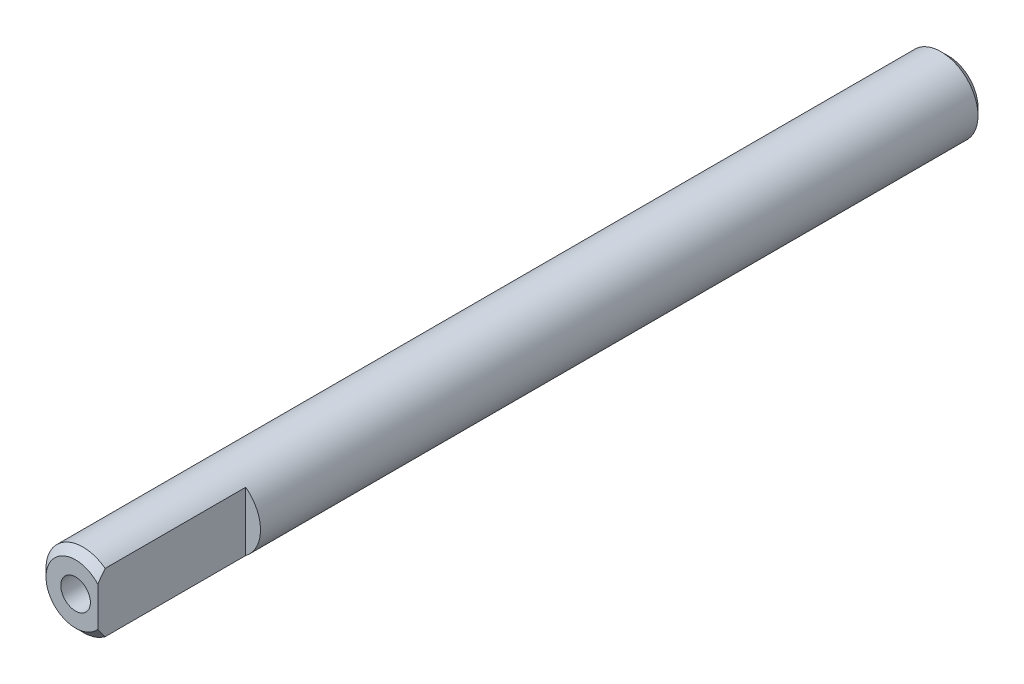
ISO-10303-21;
HEADER;
FILE_DESCRIPTION(('STEP AP214'),'2;1');
FILE_NAME('part.step','',(''),(''),'','','');
FILE_SCHEMA(('AUTOMOTIVE_DESIGN { 1 0 10303 214 1 1 1 1 }'));
ENDSEC;
DATA;
#1=APPLICATION_CONTEXT('core data for automotive mechanical design processes');
#2=APPLICATION_PROTOCOL_DEFINITION('international standard','automotive_design',2000,#1);
#3=PRODUCT_CONTEXT('',#1,'mechanical');
#4=PRODUCT('Part','Part','',(#3));
#5=PRODUCT_RELATED_PRODUCT_CATEGORY('part','',(#4));
#6=PRODUCT_DEFINITION_FORMATION('','',#4);
#7=PRODUCT_DEFINITION_CONTEXT('part definition',#1,'design');
#8=PRODUCT_DEFINITION('design','',#6,#7);
#9=PRODUCT_DEFINITION_SHAPE('','',#8);
#10=(LENGTH_UNIT() NAMED_UNIT(*) SI_UNIT(.MILLI.,.METRE.));
#11=(NAMED_UNIT(*) PLANE_ANGLE_UNIT() SI_UNIT($,.RADIAN.));
#12=(NAMED_UNIT(*) SI_UNIT($,.STERADIAN.) SOLID_ANGLE_UNIT());
#13=UNCERTAINTY_MEASURE_WITH_UNIT(LENGTH_MEASURE(1.E-05),#10,'distance_accuracy_value','');
#14=(GEOMETRIC_REPRESENTATION_CONTEXT(3) GLOBAL_UNCERTAINTY_ASSIGNED_CONTEXT((#13)) GLOBAL_UNIT_ASSIGNED_CONTEXT((#10,
#11,#12)) REPRESENTATION_CONTEXT('',''));
#15=CARTESIAN_POINT('',(0.,0.,0.));
#16=DIRECTION('',(0.,0.,1.));
#17=DIRECTION('',(1.,0.,0.));
#18=AXIS2_PLACEMENT_3D('',#15,#16,#17);
#19=CARTESIAN_POINT('',(0.,0.,59.));
#20=DIRECTION('',(0.,0.,-1.));
#21=DIRECTION('',(-1.,0.,0.));
#22=AXIS2_PLACEMENT_3D('',#19,#20,#21);
#23=CYLINDRICAL_SURFACE('',#22,2.5);
#24=CARTESIAN_POINT('',(0.,0.,58.5));
#25=DIRECTION('',(0.,0.,1.));
#26=DIRECTION('',(1.,0.,0.));
#27=AXIS2_PLACEMENT_3D('',#24,#25,#26);
#28=CIRCLE('',#27,2.5);
#29=CARTESIAN_POINT('',(1.5,-2.,58.5));
#30=VERTEX_POINT('',#29);
#31=CARTESIAN_POINT('',(1.5,2.,58.5));
#32=VERTEX_POINT('',#31);
#33=EDGE_CURVE('E121',#30,#32,#28,.F.);
#34=ORIENTED_EDGE('',*,*,#33,.T.);
#35=DIRECTION('',(0.,0.,-1.));
#36=VECTOR('',#35,1.);
#37=CARTESIAN_POINT('',(1.5,2.,59.));
#38=LINE('',#37,#36);
#39=CARTESIAN_POINT('',(1.5,2.,49.));
#40=VERTEX_POINT('',#39);
#41=EDGE_CURVE('E54',#32,#40,#38,.T.);
#42=ORIENTED_EDGE('',*,*,#41,.T.);
#43=CARTESIAN_POINT('',(0.,0.,49.));
#44=DIRECTION('',(0.,0.,-1.));
#45=DIRECTION('',(-1.,0.,0.));
#46=AXIS2_PLACEMENT_3D('',#43,#44,#45);
#47=CIRCLE('',#46,2.5);
#48=CARTESIAN_POINT('',(1.5,-2.,49.));
#49=VERTEX_POINT('',#48);
#50=EDGE_CURVE('E11',#40,#49,#47,.T.);
#51=ORIENTED_EDGE('',*,*,#50,.T.);
#52=DIRECTION('',(0.,0.,-1.));
#53=VECTOR('',#52,1.);
#54=CARTESIAN_POINT('',(1.5,-2.,59.));
#55=LINE('',#54,#53);
#56=EDGE_CURVE('E131',#49,#30,#55,.F.);
#57=ORIENTED_EDGE('',*,*,#56,.T.);
#58=EDGE_LOOP('',(#34,#42,#51,#57));
#59=FACE_BOUND('',#58,.T.);
#60=CARTESIAN_POINT('',(0.,0.,0.499999999999987));
#61=DIRECTION('',(0.,0.,1.));
#62=DIRECTION('',(1.,0.,0.));
#63=AXIS2_PLACEMENT_3D('',#60,#61,#62);
#64=CIRCLE('',#63,2.5);
#65=CARTESIAN_POINT('',(2.5,0.,0.499999999999987));
#66=VERTEX_POINT('',#65);
#67=EDGE_CURVE('E81',#66,#66,#64,.T.);
#68=ORIENTED_EDGE('',*,*,#67,.T.);
#69=EDGE_LOOP('',(#68));
#70=FACE_BOUND('',#69,.T.);
#71=ADVANCED_FACE('F32',(#59,#70),#23,.T.);
#72=CARTESIAN_POINT('',(0.,0.,59.));
#73=DIRECTION('',(0.,0.,1.));
#74=DIRECTION('',(1.,0.,0.));
#75=AXIS2_PLACEMENT_3D('',#72,#73,#74);
#76=PLANE('',#75);
#77=DIRECTION('',(0.,-1.,0.));
#78=VECTOR('',#77,1.);
#79=CARTESIAN_POINT('',(1.5,2.0137577840586,59.));
#80=LINE('',#79,#78);
#81=CARTESIAN_POINT('',(1.5,1.32287565553229,59.));
#82=VERTEX_POINT('',#81);
#83=CARTESIAN_POINT('',(1.5,-1.32287565553229,59.));
#84=VERTEX_POINT('',#83);
#85=EDGE_CURVE('E48',#82,#84,#80,.T.);
#86=ORIENTED_EDGE('',*,*,#85,.F.);
#87=CARTESIAN_POINT('',(0.,0.,59.));
#88=DIRECTION('',(0.,0.,1.));
#89=DIRECTION('',(1.,0.,0.));
#90=AXIS2_PLACEMENT_3D('',#87,#88,#89);
#91=CIRCLE('',#90,1.99999999999999);
#92=EDGE_CURVE('E75',#82,#84,#91,.T.);
#93=ORIENTED_EDGE('',*,*,#92,.T.);
#94=EDGE_LOOP('',(#86,#93));
#95=FACE_BOUND('',#94,.T.);
#96=CARTESIAN_POINT('',(0.,0.,59.));
#97=DIRECTION('',(0.,0.,1.));
#98=DIRECTION('',(1.,0.,0.));
#99=AXIS2_PLACEMENT_3D('',#96,#97,#98);
#100=CIRCLE('',#99,1.);
#101=CARTESIAN_POINT('',(1.,0.,59.));
#102=VERTEX_POINT('',#101);
#103=EDGE_CURVE('E125',#102,#102,#100,.T.);
#104=ORIENTED_EDGE('',*,*,#103,.F.);
#105=EDGE_LOOP('',(#104));
#106=FACE_BOUND('',#105,.T.);
#107=ADVANCED_FACE('F73',(#95,#106),#76,.T.);
#108=CARTESIAN_POINT('',(0.,0.,0.));
#109=DIRECTION('',(0.,0.,1.));
#110=DIRECTION('',(1.,0.,0.));
#111=AXIS2_PLACEMENT_3D('',#108,#109,#110);
#112=PLANE('',#111);
#113=CARTESIAN_POINT('',(0.,0.,0.));
#114=DIRECTION('',(0.,0.,1.));
#115=DIRECTION('',(1.,0.,0.));
#116=AXIS2_PLACEMENT_3D('',#113,#114,#115);
#117=CIRCLE('',#116,2.00000000000002);
#118=CARTESIAN_POINT('',(2.00000000000002,0.,0.));
#119=VERTEX_POINT('',#118);
#120=EDGE_CURVE('E78',#119,#119,#117,.F.);
#121=ORIENTED_EDGE('',*,*,#120,.T.);
#122=EDGE_LOOP('',(#121));
#123=FACE_BOUND('',#122,.T.);
#124=ADVANCED_FACE('F102',(#123),#112,.F.);
#125=CARTESIAN_POINT('',(0.,0.,49.));
#126=DIRECTION('',(0.,0.,1.));
#127=DIRECTION('',(1.,0.,0.));
#128=AXIS2_PLACEMENT_3D('',#125,#126,#127);
#129=CYLINDRICAL_SURFACE('',#128,1.);
#130=CARTESIAN_POINT('',(0.,0.,49.));
#131=DIRECTION('',(0.,0.,1.));
#132=DIRECTION('',(1.,0.,0.));
#133=AXIS2_PLACEMENT_3D('',#130,#131,#132);
#134=CIRCLE('',#133,1.);
#135=CARTESIAN_POINT('',(1.,0.,49.));
#136=VERTEX_POINT('',#135);
#137=EDGE_CURVE('E122',#136,#136,#134,.T.);
#138=ORIENTED_EDGE('',*,*,#137,.F.);
#139=EDGE_LOOP('',(#138));
#140=FACE_BOUND('',#139,.T.);
#141=ORIENTED_EDGE('',*,*,#103,.T.);
#142=EDGE_LOOP('',(#141));
#143=FACE_BOUND('',#142,.T.);
#144=ADVANCED_FACE('F98',(#140,#143),#129,.F.);
#145=CARTESIAN_POINT('',(0.,0.,49.));
#146=DIRECTION('',(0.,0.,1.));
#147=DIRECTION('',(1.,0.,0.));
#148=AXIS2_PLACEMENT_3D('',#145,#146,#147);
#149=PLANE('',#148);
#150=ORIENTED_EDGE('',*,*,#137,.T.);
#151=EDGE_LOOP('',(#150));
#152=FACE_BOUND('',#151,.T.);
#153=ADVANCED_FACE('F94',(#152),#149,.T.);
#154=CARTESIAN_POINT('',(0.,0.,0.499999999999987));
#155=DIRECTION('',(0.,0.,1.));
#156=DIRECTION('',(1.,0.,0.));
#157=AXIS2_PLACEMENT_3D('',#154,#155,#156);
#158=CONICAL_SURFACE('',#157,2.5,0.785398163397446);
#159=ORIENTED_EDGE('',*,*,#120,.F.);
#160=EDGE_LOOP('',(#159));
#161=FACE_BOUND('',#160,.T.);
#162=ORIENTED_EDGE('',*,*,#67,.F.);
#163=EDGE_LOOP('',(#162));
#164=FACE_BOUND('',#163,.T.);
#165=ADVANCED_FACE('F97',(#161,#164),#158,.T.);
#166=CARTESIAN_POINT('',(0.,0.,59.));
#167=DIRECTION('',(0.,0.,-1.));
#168=DIRECTION('',(-1.,0.,0.));
#169=AXIS2_PLACEMENT_3D('',#166,#167,#168);
#170=CONICAL_SURFACE('',#169,1.99999999999999,0.785398163397446);
#171=CARTESIAN_POINT('',(1.5,4.73877766066217,56.0294855681538));
#172=CARTESIAN_POINT('',(1.5,4.57087688496675,56.1894995243112));
#173=CARTESIAN_POINT('',(1.5,4.4026412725615,56.3491686097775));
#174=CARTESIAN_POINT('',(1.5,4.06504406572239,56.6674191827178));
#175=CARTESIAN_POINT('',(1.5,3.89568212935415,56.8260003071563));
#176=CARTESIAN_POINT('',(1.5,3.55381801072381,57.1431185138608));
#177=CARTESIAN_POINT('',(1.5,3.38130131701554,57.3016399799348));
#178=CARTESIAN_POINT('',(1.5,3.03406968083858,57.6162003868283));
#179=CARTESIAN_POINT('',(1.5,2.85935519817906,57.7722398319471));
#180=CARTESIAN_POINT('',(1.5,2.56436967895075,58.029699684085));
#181=CARTESIAN_POINT('',(1.5,2.44506547574178,58.1322257249929));
#182=CARTESIAN_POINT('',(1.5,2.20415663927864,58.3346678933572));
#183=CARTESIAN_POINT('',(1.5,2.08255105769494,58.4345829026498));
#184=CARTESIAN_POINT('',(1.5,1.89781800131047,58.5812533338808));
#185=CARTESIAN_POINT('',(1.5,1.83592231177611,58.629558352091));
#186=CARTESIAN_POINT('',(1.5,1.71112471879182,58.724847752878));
#187=CARTESIAN_POINT('',(1.5,1.64822287767979,58.7718322167785));
#188=CARTESIAN_POINT('',(1.5,1.52121957181447,58.8640681693664));
#189=CARTESIAN_POINT('',(1.5,1.45711892352518,58.9093207778492));
#190=CARTESIAN_POINT('',(1.5,1.32739258678534,58.9975747339442));
#191=CARTESIAN_POINT('',(1.5,1.26176720929576,59.0405765348783));
#192=CARTESIAN_POINT('',(1.5,1.14377613499673,59.114102161164));
#193=CARTESIAN_POINT('',(1.5,1.09179339806719,59.1452378266735));
#194=CARTESIAN_POINT('',(1.5,0.986495644009836,59.2052025641598));
#195=CARTESIAN_POINT('',(1.5,0.93318043551107,59.234031302286));
#196=CARTESIAN_POINT('',(1.5,0.825060030354659,59.2886982840608));
#197=CARTESIAN_POINT('',(1.5,0.770255829921558,59.3145384692095));
#198=CARTESIAN_POINT('',(1.5,0.659021720111626,59.362385498086));
#199=CARTESIAN_POINT('',(1.5,0.602592311849216,59.384393508982));
#200=CARTESIAN_POINT('',(1.5,0.457667787547021,59.4338815356688));
#201=CARTESIAN_POINT('',(1.5,0.367977824314464,59.4581125580888));
#202=CARTESIAN_POINT('',(1.5,0.231531062374166,59.4828971991606));
#203=CARTESIAN_POINT('',(1.5,0.185796860832829,59.4892309275958));
#204=CARTESIAN_POINT('',(1.5,0.0939332807516576,59.4977558046999));
#205=CARTESIAN_POINT('',(1.5,0.0478039269300878,59.4999472106131));
#206=CARTESIAN_POINT('',(1.5,-0.0446213260047386,59.5000511071121));
#207=CARTESIAN_POINT('',(1.5,-0.0909172370300651,59.4979484340554));
#208=CARTESIAN_POINT('',(1.5,-0.183125422109013,59.4895610051492));
#209=CARTESIAN_POINT('',(1.5,-0.229037670342021,59.4832759700843));
#210=CARTESIAN_POINT('',(1.5,-0.320308085056699,59.4668419462001));
#211=CARTESIAN_POINT('',(1.5,-0.365663991153476,59.4566805796926));
#212=CARTESIAN_POINT('',(1.5,-0.455470901434249,59.4329717690875));
#213=CARTESIAN_POINT('',(1.5,-0.499921832685305,59.4194240532392));
#214=CARTESIAN_POINT('',(1.5,-0.638990544229036,59.3720258027561));
#215=CARTESIAN_POINT('',(1.5,-0.731807977692379,59.3328918263331));
#216=CARTESIAN_POINT('',(1.5,-0.913171535254294,59.2457111627384));
#217=CARTESIAN_POINT('',(1.5,-1.00170906077429,59.1976474023647));
#218=CARTESIAN_POINT('',(1.5,-1.17658155020874,59.0949344594174));
#219=CARTESIAN_POINT('',(1.5,-1.26286538036913,59.040199262787));
#220=CARTESIAN_POINT('',(1.5,-1.39019093097401,58.9550925976411));
#221=CARTESIAN_POINT('',(1.5,-1.43226557856606,58.926235768808));
#222=CARTESIAN_POINT('',(1.5,-1.51581922319294,58.8676729342921));
#223=CARTESIAN_POINT('',(1.5,-1.55729823832287,58.8379669544885));
#224=CARTESIAN_POINT('',(1.5,-1.67949825432405,58.7488593417759));
#225=CARTESIAN_POINT('',(1.5,-1.75948332591062,58.688449558798));
#226=CARTESIAN_POINT('',(1.5,-1.91793626524161,58.5656664508627));
#227=CARTESIAN_POINT('',(1.5,-1.99640394923245,58.5032928904687));
#228=CARTESIAN_POINT('',(1.5,-2.15218272045304,58.3770614816031));
#229=CARTESIAN_POINT('',(1.5,-2.22949335581845,58.3132030768959));
#230=CARTESIAN_POINT('',(1.5,-2.38317775548549,58.1843670252063));
#231=CARTESIAN_POINT('',(1.5,-2.45955149025559,58.1193893430983));
#232=CARTESIAN_POINT('',(1.5,-2.68785964672396,57.9229024621172));
#233=CARTESIAN_POINT('',(1.5,-2.83867334147213,57.7900922814195));
#234=CARTESIAN_POINT('',(1.5,-3.1382879010167,57.5223023420556));
#235=CARTESIAN_POINT('',(1.5,-3.2870892153285,57.3873230831566));
#236=CARTESIAN_POINT('',(1.5,-3.56785869065454,57.130012231076));
#237=CARTESIAN_POINT('',(1.5,-3.69996380911557,57.0078298643369));
#238=CARTESIAN_POINT('',(1.5,-3.96335148514681,56.762564962948));
#239=CARTESIAN_POINT('',(1.5,-4.09463398576682,56.6394823672259));
#240=CARTESIAN_POINT('',(1.5,-4.35606203580844,56.3931176044447));
#241=CARTESIAN_POINT('',(1.5,-4.48621001460236,56.2698380126439));
#242=CARTESIAN_POINT('',(1.5,-4.7459940570781,56.0227631590774));
#243=CARTESIAN_POINT('',(1.5,-4.87563016456396,55.8989679433854));
#244=CARTESIAN_POINT('',(1.5,-5.00508068974938,55.7749801233964));
#245=B_SPLINE_CURVE_WITH_KNOTS('',3,(#171,#172,#173,#174,#175,#176,#177,#178,#179,#180,#181,
#182,#183,#184,#185,#186,#187,#188,#189,#190,#191,#192,#193,#194,#195,#196,#197,#198,#199,#200,
#201,#202,#203,#204,#205,#206,#207,#208,#209,#210,#211,#212,#213,#214,#215,#216,#217,#218,#219,
#220,#221,#222,#223,#224,#225,#226,#227,#228,#229,#230,#231,#232,#233,#234,#235,#236,#237,#238,
#239,#240,#241,#242,#243,#244),.UNSPECIFIED.,.F.,.F.,(4,2,2,2,2,2,2,2,2,2,2,2,2,2,2,2,2,2,2,2,2,
2,2,2,2,2,2,2,2,2,2,2,2,2,2,2,4),(0.,0.695819874426228,1.39186162381792,2.09471451659879,
2.79742273039286,3.26931840318271,3.74141295728709,3.97694200345172,4.21245651308708,
4.44781607668748,4.68312805405794,4.86486386509841,5.04662592894354,5.22826924060483,
5.40985713189323,5.68735133079222,5.82570372079616,5.96404751863254,6.10288069336224,
6.24172313754716,6.38101268791344,6.52031341969679,6.8216769971387,7.12362280616791,
7.42998356095069,7.58303588211516,7.73608354372962,8.03674021500172,8.33743307022306,
8.63824044258295,8.93905727228823,9.54188534412323,10.1445764579404,10.6844065987389,
11.2242737081984,11.7620705694968,12.2998203648654),.UNSPECIFIED.);
#246=EDGE_CURVE('E41',#32,#82,#245,.T.);
#247=ORIENTED_EDGE('',*,*,#246,.F.);
#248=ORIENTED_EDGE('',*,*,#33,.F.);
#249=EDGE_CURVE('E70',#84,#30,#245,.T.);
#250=ORIENTED_EDGE('',*,*,#249,.F.);
#251=ORIENTED_EDGE('',*,*,#92,.F.);
#252=EDGE_LOOP('',(#247,#248,#250,#251));
#253=FACE_BOUND('',#252,.T.);
#254=ADVANCED_FACE('F34',(#253),#170,.T.);
#255=CARTESIAN_POINT('',(0.,0.,49.));
#256=DIRECTION('',(0.,0.,-1.));
#257=DIRECTION('',(-1.,0.,0.));
#258=AXIS2_PLACEMENT_3D('',#255,#256,#257);
#259=PLANE('',#258);
#260=DIRECTION('',(0.,-1.,0.));
#261=VECTOR('',#260,1.);
#262=CARTESIAN_POINT('',(1.5,2.0137577840586,49.));
#263=LINE('',#262,#261);
#264=EDGE_CURVE('E76',#40,#49,#263,.T.);
#265=ORIENTED_EDGE('',*,*,#264,.T.);
#266=ORIENTED_EDGE('',*,*,#50,.F.);
#267=EDGE_LOOP('',(#265,#266));
#268=FACE_BOUND('',#267,.T.);
#269=ADVANCED_FACE('F93',(#268),#259,.F.);
#270=CARTESIAN_POINT('',(1.5,2.0137577840586,49.));
#271=DIRECTION('',(-1.,0.,0.));
#272=DIRECTION('',(0.,-1.,0.));
#273=AXIS2_PLACEMENT_3D('',#270,#271,#272);
#274=PLANE('',#273);
#275=ORIENTED_EDGE('',*,*,#246,.T.);
#276=ORIENTED_EDGE('',*,*,#85,.T.);
#277=ORIENTED_EDGE('',*,*,#249,.T.);
#278=ORIENTED_EDGE('',*,*,#56,.F.);
#279=ORIENTED_EDGE('',*,*,#264,.F.);
#280=ORIENTED_EDGE('',*,*,#41,.F.);
#281=EDGE_LOOP('',(#275,#276,#277,#278,#279,#280));
#282=FACE_BOUND('',#281,.T.);
#283=ADVANCED_FACE('F65',(#282),#274,.F.);
#284=CLOSED_SHELL('',(#71,#107,#124,#144,#153,#165,#254,#269,#283));
#285=MANIFOLD_SOLID_BREP('B2',#284);
#286=ADVANCED_BREP_SHAPE_REPRESENTATION('',(#18,#285),#14);
#287=SHAPE_DEFINITION_REPRESENTATION(#9,#286);
ENDSEC;
END-ISO-10303-21;
